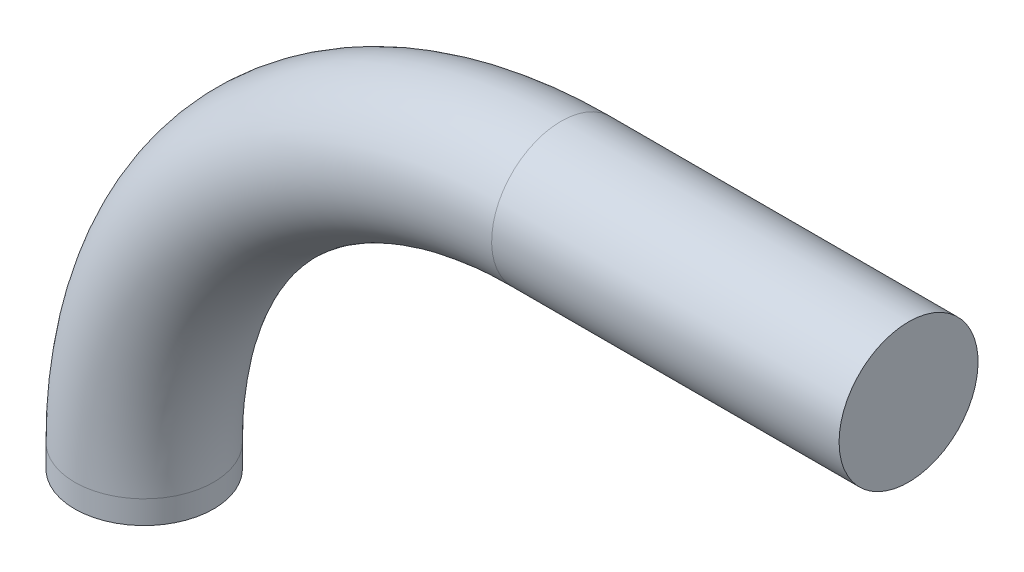
ISO-10303-21;
HEADER;
FILE_DESCRIPTION(('STEP AP214'),'2;1');
FILE_NAME('part.step','',(''),(''),'','','');
FILE_SCHEMA(('AUTOMOTIVE_DESIGN { 1 0 10303 214 1 1 1 1 }'));
ENDSEC;
DATA;
#1=APPLICATION_CONTEXT('core data for automotive mechanical design processes');
#2=APPLICATION_PROTOCOL_DEFINITION('international standard','automotive_design',2000,#1);
#3=PRODUCT_CONTEXT('',#1,'mechanical');
#4=PRODUCT('Part','Part','',(#3));
#5=PRODUCT_RELATED_PRODUCT_CATEGORY('part','',(#4));
#6=PRODUCT_DEFINITION_FORMATION('','',#4);
#7=PRODUCT_DEFINITION_CONTEXT('part definition',#1,'design');
#8=PRODUCT_DEFINITION('design','',#6,#7);
#9=PRODUCT_DEFINITION_SHAPE('','',#8);
#10=(LENGTH_UNIT() NAMED_UNIT(*) SI_UNIT(.MILLI.,.METRE.));
#11=(NAMED_UNIT(*) PLANE_ANGLE_UNIT() SI_UNIT($,.RADIAN.));
#12=(NAMED_UNIT(*) SI_UNIT($,.STERADIAN.) SOLID_ANGLE_UNIT());
#13=UNCERTAINTY_MEASURE_WITH_UNIT(LENGTH_MEASURE(1.E-05),#10,'distance_accuracy_value','');
#14=(GEOMETRIC_REPRESENTATION_CONTEXT(3) GLOBAL_UNCERTAINTY_ASSIGNED_CONTEXT((#13)) GLOBAL_UNIT_ASSIGNED_CONTEXT((#10,
#11,#12)) REPRESENTATION_CONTEXT('',''));
#15=CARTESIAN_POINT('',(0.,0.,0.));
#16=DIRECTION('',(0.,0.,1.));
#17=DIRECTION('',(1.,0.,0.));
#18=AXIS2_PLACEMENT_3D('',#15,#16,#17);
#19=CARTESIAN_POINT('',(0.,0.,0.));
#20=DIRECTION('',(0.,1.,0.));
#21=DIRECTION('',(0.,0.,1.));
#22=AXIS2_PLACEMENT_3D('',#19,#20,#21);
#23=PLANE('',#22);
#24=CARTESIAN_POINT('',(0.,0.,0.));
#25=DIRECTION('',(0.,1.,0.));
#26=DIRECTION('',(0.,0.,1.));
#27=AXIS2_PLACEMENT_3D('',#24,#25,#26);
#28=CIRCLE('',#27,3.);
#29=CARTESIAN_POINT('',(1.11022302462516E-13,0.,2.99999999999967));
#30=VERTEX_POINT('',#29);
#31=EDGE_CURVE('E44',#30,#30,#28,.T.);
#32=ORIENTED_EDGE('',*,*,#31,.F.);
#33=EDGE_LOOP('',(#32));
#34=FACE_BOUND('',#33,.T.);
#35=ADVANCED_FACE('F32',(#34),#23,.F.);
#36=CARTESIAN_POINT('',(32.9999999999995,19.,0.));
#37=DIRECTION('',(1.,0.,0.));
#38=DIRECTION('',(0.,0.,1.));
#39=AXIS2_PLACEMENT_3D('',#36,#37,#38);
#40=PLANE('',#39);
#41=CARTESIAN_POINT('',(32.9999999999995,19.,0.));
#42=DIRECTION('',(1.,0.,0.));
#43=DIRECTION('',(0.,0.,1.));
#44=AXIS2_PLACEMENT_3D('',#41,#42,#43);
#45=CIRCLE('',#44,3.);
#46=CARTESIAN_POINT('',(32.9999999999997,18.9999999999999,3.00000000000011));
#47=VERTEX_POINT('',#46);
#48=EDGE_CURVE('E11',#47,#47,#45,.T.);
#49=ORIENTED_EDGE('',*,*,#48,.T.);
#50=EDGE_LOOP('',(#49));
#51=FACE_BOUND('',#50,.T.);
#52=ADVANCED_FACE('F47',(#51),#40,.T.);
#53=CARTESIAN_POINT('',(0.,0.,0.));
#54=DIRECTION('',(0.,1.,0.));
#55=DIRECTION('',(0.,0.,1.));
#56=AXIS2_PLACEMENT_3D('',#53,#54,#55);
#57=CYLINDRICAL_SURFACE('',#56,3.);
#58=CARTESIAN_POINT('',(-1.11022302462516E-13,0.99999999999989,0.));
#59=DIRECTION('',(0.,1.,0.));
#60=DIRECTION('',(0.,0.,1.));
#61=AXIS2_PLACEMENT_3D('',#58,#59,#60);
#62=CIRCLE('',#61,3.);
#63=CARTESIAN_POINT('',(-3.0000000000001,0.999999999999871,0.));
#64=VERTEX_POINT('',#63);
#65=EDGE_CURVE('E57',#64,#64,#62,.T.);
#66=ORIENTED_EDGE('',*,*,#65,.F.);
#67=EDGE_LOOP('',(#66));
#68=FACE_BOUND('',#67,.T.);
#69=ORIENTED_EDGE('',*,*,#31,.T.);
#70=EDGE_LOOP('',(#69));
#71=FACE_BOUND('',#70,.T.);
#72=ADVANCED_FACE('F62',(#68,#71),#57,.T.);
#73=CARTESIAN_POINT('',(17.9999999999999,1.,0.));
#74=DIRECTION('',(0.,0.,-1.));
#75=DIRECTION('',(-1.,0.,0.));
#76=AXIS2_PLACEMENT_3D('',#73,#74,#75);
#77=TOROIDAL_SURFACE('',#76,18.,3.);
#78=CARTESIAN_POINT('',(17.9999999999998,18.9999999999999,0.));
#79=DIRECTION('',(1.,0.,0.));
#80=DIRECTION('',(0.,0.,1.));
#81=AXIS2_PLACEMENT_3D('',#78,#79,#80);
#82=CIRCLE('',#81,3.);
#83=CARTESIAN_POINT('',(17.9999999999998,22.,0.));
#84=VERTEX_POINT('',#83);
#85=EDGE_CURVE('E39',#84,#84,#82,.T.);
#86=CARTESIAN_POINT('',(17.9999999999999,1.,0.));
#87=DIRECTION('',(0.,0.,-1.));
#88=DIRECTION('',(-1.,0.,0.));
#89=AXIS2_PLACEMENT_3D('',#86,#87,#88);
#90=CIRCLE('',#89,21.);
#91=EDGE_CURVE('',#64,#84,#90,.T.);
#92=ORIENTED_EDGE('',*,*,#65,.T.);
#93=ORIENTED_EDGE('',*,*,#85,.F.);
#94=ORIENTED_EDGE('',*,*,#91,.T.);
#95=ORIENTED_EDGE('',*,*,#91,.F.);
#96=EDGE_LOOP('',(#92,#94,#93,#95));
#97=FACE_BOUND('',#96,.T.);
#98=ADVANCED_FACE('F52',(#97),#77,.T.);
#99=CARTESIAN_POINT('',(17.9999999999998,18.9999999999999,0.));
#100=DIRECTION('',(1.,0.,0.));
#101=DIRECTION('',(0.,0.,-1.));
#102=AXIS2_PLACEMENT_3D('',#99,#100,#101);
#103=CYLINDRICAL_SURFACE('',#102,3.);
#104=ORIENTED_EDGE('',*,*,#48,.F.);
#105=EDGE_LOOP('',(#104));
#106=FACE_BOUND('',#105,.T.);
#107=ORIENTED_EDGE('',*,*,#85,.T.);
#108=EDGE_LOOP('',(#107));
#109=FACE_BOUND('',#108,.T.);
#110=ADVANCED_FACE('F49',(#106,#109),#103,.T.);
#111=CLOSED_SHELL('',(#35,#52,#72,#98,#110));
#112=MANIFOLD_SOLID_BREP('B2',#111);
#113=ADVANCED_BREP_SHAPE_REPRESENTATION('',(#18,#112),#14);
#114=SHAPE_DEFINITION_REPRESENTATION(#9,#113);
ENDSEC;
END-ISO-10303-21;
